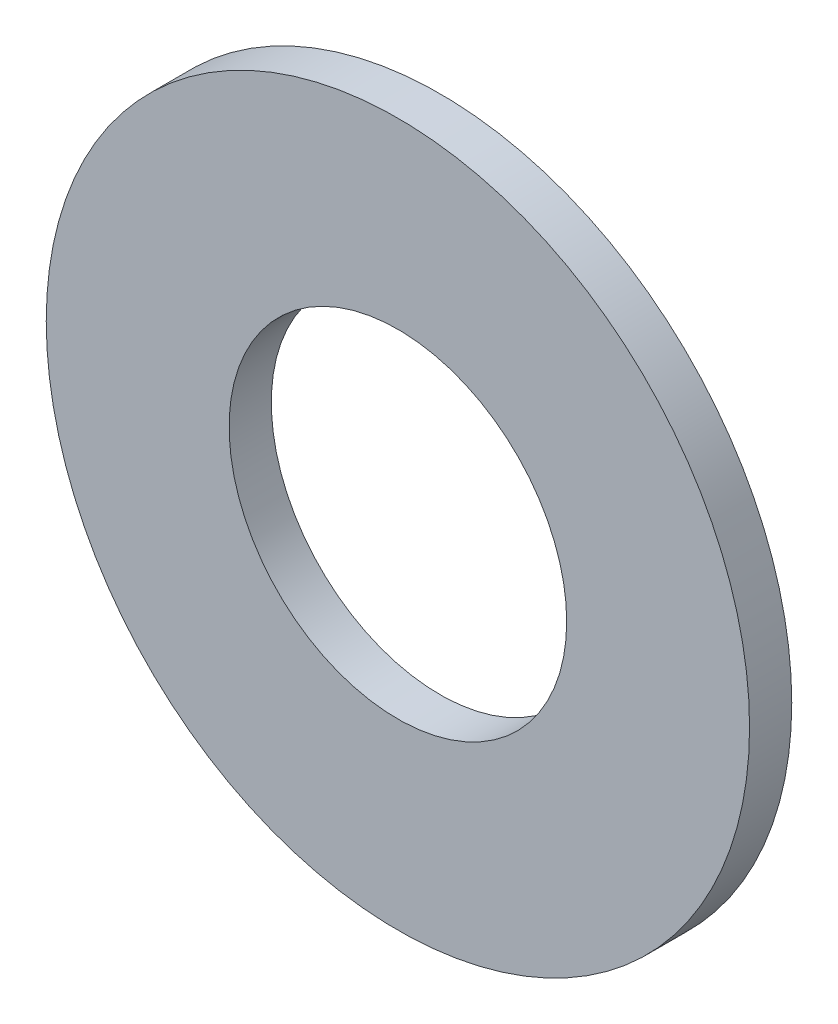
ISO-10303-21;
HEADER;
FILE_DESCRIPTION(('STEP AP214'),'2;1');
FILE_NAME('part.step','',(''),(''),'','','');
FILE_SCHEMA(('AUTOMOTIVE_DESIGN { 1 0 10303 214 1 1 1 1 }'));
ENDSEC;
DATA;
#1=APPLICATION_CONTEXT('core data for automotive mechanical design processes');
#2=APPLICATION_PROTOCOL_DEFINITION('international standard','automotive_design',2000,#1);
#3=PRODUCT_CONTEXT('',#1,'mechanical');
#4=PRODUCT('Part','Part','',(#3));
#5=PRODUCT_RELATED_PRODUCT_CATEGORY('part','',(#4));
#6=PRODUCT_DEFINITION_FORMATION('','',#4);
#7=PRODUCT_DEFINITION_CONTEXT('part definition',#1,'design');
#8=PRODUCT_DEFINITION('design','',#6,#7);
#9=PRODUCT_DEFINITION_SHAPE('','',#8);
#10=(LENGTH_UNIT() NAMED_UNIT(*) SI_UNIT(.MILLI.,.METRE.));
#11=(NAMED_UNIT(*) PLANE_ANGLE_UNIT() SI_UNIT($,.RADIAN.));
#12=(NAMED_UNIT(*) SI_UNIT($,.STERADIAN.) SOLID_ANGLE_UNIT());
#13=UNCERTAINTY_MEASURE_WITH_UNIT(LENGTH_MEASURE(1.E-05),#10,'distance_accuracy_value','');
#14=(GEOMETRIC_REPRESENTATION_CONTEXT(3) GLOBAL_UNCERTAINTY_ASSIGNED_CONTEXT((#13)) GLOBAL_UNIT_ASSIGNED_CONTEXT((#10,
#11,#12)) REPRESENTATION_CONTEXT('',''));
#15=CARTESIAN_POINT('',(0.,0.,0.));
#16=DIRECTION('',(0.,0.,1.));
#17=DIRECTION('',(1.,0.,0.));
#18=AXIS2_PLACEMENT_3D('',#15,#16,#17);
#19=CARTESIAN_POINT('',(0.,0.,0.3));
#20=DIRECTION('',(0.,0.,1.));
#21=DIRECTION('',(1.,0.,0.));
#22=AXIS2_PLACEMENT_3D('',#19,#20,#21);
#23=PLANE('',#22);
#24=CARTESIAN_POINT('',(0.,0.,0.3));
#25=DIRECTION('',(0.,0.,1.));
#26=DIRECTION('',(1.,0.,0.));
#27=AXIS2_PLACEMENT_3D('',#24,#25,#26);
#28=CIRCLE('',#27,2.5);
#29=CARTESIAN_POINT('',(2.5,0.,0.3));
#30=VERTEX_POINT('',#29);
#31=EDGE_CURVE('E10',#30,#30,#28,.T.);
#32=ORIENTED_EDGE('',*,*,#31,.T.);
#33=EDGE_LOOP('',(#32));
#34=FACE_BOUND('',#33,.T.);
#35=CARTESIAN_POINT('',(0.,0.,0.3));
#36=DIRECTION('',(0.,0.,1.));
#37=DIRECTION('',(1.,0.,0.));
#38=AXIS2_PLACEMENT_3D('',#35,#36,#37);
#39=CIRCLE('',#38,1.2);
#40=CARTESIAN_POINT('',(1.2,0.,0.3));
#41=VERTEX_POINT('',#40);
#42=EDGE_CURVE('E33',#41,#41,#39,.T.);
#43=ORIENTED_EDGE('',*,*,#42,.F.);
#44=EDGE_LOOP('',(#43));
#45=FACE_BOUND('',#44,.T.);
#46=ADVANCED_FACE('F22',(#34,#45),#23,.T.);
#47=CARTESIAN_POINT('',(0.,0.,0.));
#48=DIRECTION('',(0.,0.,1.));
#49=DIRECTION('',(1.,0.,0.));
#50=AXIS2_PLACEMENT_3D('',#47,#48,#49);
#51=PLANE('',#50);
#52=CARTESIAN_POINT('',(0.,0.,0.));
#53=DIRECTION('',(0.,0.,1.));
#54=DIRECTION('',(1.,0.,0.));
#55=AXIS2_PLACEMENT_3D('',#52,#53,#54);
#56=CIRCLE('',#55,2.5);
#57=CARTESIAN_POINT('',(2.5,0.,0.));
#58=VERTEX_POINT('',#57);
#59=EDGE_CURVE('E29',#58,#58,#56,.T.);
#60=ORIENTED_EDGE('',*,*,#59,.F.);
#61=EDGE_LOOP('',(#60));
#62=FACE_BOUND('',#61,.T.);
#63=CARTESIAN_POINT('',(0.,0.,0.));
#64=DIRECTION('',(0.,0.,1.));
#65=DIRECTION('',(1.,0.,0.));
#66=AXIS2_PLACEMENT_3D('',#63,#64,#65);
#67=CIRCLE('',#66,1.2);
#68=CARTESIAN_POINT('',(1.2,0.,0.));
#69=VERTEX_POINT('',#68);
#70=EDGE_CURVE('E37',#69,#69,#67,.T.);
#71=ORIENTED_EDGE('',*,*,#70,.T.);
#72=EDGE_LOOP('',(#71));
#73=FACE_BOUND('',#72,.T.);
#74=ADVANCED_FACE('F43',(#62,#73),#51,.F.);
#75=CARTESIAN_POINT('',(0.,0.,0.3));
#76=DIRECTION('',(0.,0.,-1.));
#77=DIRECTION('',(-1.,0.,0.));
#78=AXIS2_PLACEMENT_3D('',#75,#76,#77);
#79=CYLINDRICAL_SURFACE('',#78,2.5);
#80=ORIENTED_EDGE('',*,*,#31,.F.);
#81=EDGE_LOOP('',(#80));
#82=FACE_BOUND('',#81,.T.);
#83=ORIENTED_EDGE('',*,*,#59,.T.);
#84=EDGE_LOOP('',(#83));
#85=FACE_BOUND('',#84,.T.);
#86=ADVANCED_FACE('F24',(#82,#85),#79,.T.);
#87=CARTESIAN_POINT('',(0.,0.,0.3));
#88=DIRECTION('',(0.,0.,-1.));
#89=DIRECTION('',(-1.,0.,0.));
#90=AXIS2_PLACEMENT_3D('',#87,#88,#89);
#91=CYLINDRICAL_SURFACE('',#90,1.2);
#92=ORIENTED_EDGE('',*,*,#42,.T.);
#93=EDGE_LOOP('',(#92));
#94=FACE_BOUND('',#93,.T.);
#95=ORIENTED_EDGE('',*,*,#70,.F.);
#96=EDGE_LOOP('',(#95));
#97=FACE_BOUND('',#96,.T.);
#98=ADVANCED_FACE('F45',(#94,#97),#91,.F.);
#99=CLOSED_SHELL('',(#46,#74,#86,#98));
#100=MANIFOLD_SOLID_BREP('B2',#99);
#101=ADVANCED_BREP_SHAPE_REPRESENTATION('',(#18,#100),#14);
#102=SHAPE_DEFINITION_REPRESENTATION(#9,#101);
ENDSEC;
END-ISO-10303-21;
